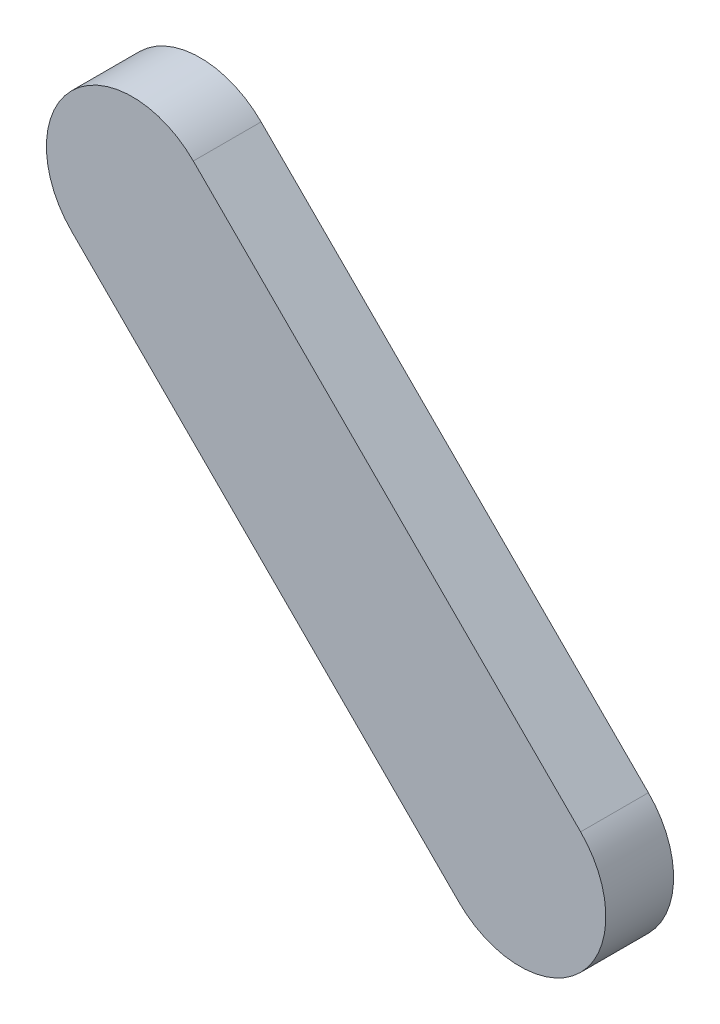
ISO-10303-21;
HEADER;
FILE_DESCRIPTION(('STEP AP214'),'2;1');
FILE_NAME('part.step','',(''),(''),'','','');
FILE_SCHEMA(('AUTOMOTIVE_DESIGN { 1 0 10303 214 1 1 1 1 }'));
ENDSEC;
DATA;
#1=APPLICATION_CONTEXT('core data for automotive mechanical design processes');
#2=APPLICATION_PROTOCOL_DEFINITION('international standard','automotive_design',2000,#1);
#3=PRODUCT_CONTEXT('',#1,'mechanical');
#4=PRODUCT('Part','Part','',(#3));
#5=PRODUCT_RELATED_PRODUCT_CATEGORY('part','',(#4));
#6=PRODUCT_DEFINITION_FORMATION('','',#4);
#7=PRODUCT_DEFINITION_CONTEXT('part definition',#1,'design');
#8=PRODUCT_DEFINITION('design','',#6,#7);
#9=PRODUCT_DEFINITION_SHAPE('','',#8);
#10=(LENGTH_UNIT() NAMED_UNIT(*) SI_UNIT(.MILLI.,.METRE.));
#11=(NAMED_UNIT(*) PLANE_ANGLE_UNIT() SI_UNIT($,.RADIAN.));
#12=(NAMED_UNIT(*) SI_UNIT($,.STERADIAN.) SOLID_ANGLE_UNIT());
#13=UNCERTAINTY_MEASURE_WITH_UNIT(LENGTH_MEASURE(1.E-05),#10,'distance_accuracy_value','');
#14=(GEOMETRIC_REPRESENTATION_CONTEXT(3) GLOBAL_UNCERTAINTY_ASSIGNED_CONTEXT((#13)) GLOBAL_UNIT_ASSIGNED_CONTEXT((#10,
#11,#12)) REPRESENTATION_CONTEXT('',''));
#15=CARTESIAN_POINT('',(0.,0.,0.));
#16=DIRECTION('',(0.,0.,1.));
#17=DIRECTION('',(1.,0.,0.));
#18=AXIS2_PLACEMENT_3D('',#15,#16,#17);
#19=CARTESIAN_POINT('',(130.37639406,107.36399406,0.));
#20=DIRECTION('',(0.707106781186548,0.707106781186548,0.));
#21=DIRECTION('',(0.707106781186548,-0.707106781186548,0.));
#22=AXIS2_PLACEMENT_3D('',#19,#20,#21);
#23=PLANE('',#22);
#24=DIRECTION('',(0.707106781186548,-0.707106781186548,0.));
#25=VECTOR('',#24,1.);
#26=CARTESIAN_POINT('',(130.37639406,107.36399406,0.1999996));
#27=LINE('',#26,#25);
#28=CARTESIAN_POINT('',(130.37639406,107.36399406,0.1999996));
#29=VERTEX_POINT('',#28);
#30=CARTESIAN_POINT('',(131.51939406,106.22099406,0.1999996));
#31=VERTEX_POINT('',#30);
#32=EDGE_CURVE('E11',#29,#31,#27,.T.);
#33=ORIENTED_EDGE('',*,*,#32,.F.);
#34=DIRECTION('',(0.,0.,1.));
#35=VECTOR('',#34,1.);
#36=CARTESIAN_POINT('',(130.37639406,107.36399406,0.));
#37=LINE('',#36,#35);
#38=CARTESIAN_POINT('',(130.37639406,107.36399406,0.));
#39=VERTEX_POINT('',#38);
#40=EDGE_CURVE('E24',#39,#29,#37,.T.);
#41=ORIENTED_EDGE('',*,*,#40,.F.);
#42=DIRECTION('',(0.707106781186548,-0.707106781186548,0.));
#43=VECTOR('',#42,1.);
#44=CARTESIAN_POINT('',(130.37639406,107.36399406,0.));
#45=LINE('',#44,#43);
#46=CARTESIAN_POINT('',(131.51939406,106.22099406,0.));
#47=VERTEX_POINT('',#46);
#48=EDGE_CURVE('E75',#39,#47,#45,.T.);
#49=ORIENTED_EDGE('',*,*,#48,.T.);
#50=DIRECTION('',(0.,0.,1.));
#51=VECTOR('',#50,1.);
#52=CARTESIAN_POINT('',(131.51939406,106.22099406,0.));
#53=LINE('',#52,#51);
#54=EDGE_CURVE('E37',#47,#31,#53,.T.);
#55=ORIENTED_EDGE('',*,*,#54,.T.);
#56=EDGE_LOOP('',(#33,#41,#49,#55));
#57=FACE_BOUND('',#56,.T.);
#58=ADVANCED_FACE('F17',(#57),#23,.F.);
#59=CARTESIAN_POINT('',(131.699,106.4006,0.));
#60=DIRECTION('',(0.,0.,-1.));
#61=DIRECTION('',(-0.707106781186576,-0.70710678118652,0.));
#62=AXIS2_PLACEMENT_3D('',#59,#60,#61);
#63=CYLINDRICAL_SURFACE('',#62,0.254001156230768);
#64=CARTESIAN_POINT('',(131.699,106.4006,0.1999996));
#65=DIRECTION('',(0.,0.,1.));
#66=DIRECTION('',(-0.707106781186576,-0.70710678118652,0.));
#67=AXIS2_PLACEMENT_3D('',#64,#65,#66);
#68=CIRCLE('',#67,0.254001156230768);
#69=CARTESIAN_POINT('',(131.87860594,106.58020594,0.1999996));
#70=VERTEX_POINT('',#69);
#71=EDGE_CURVE('E83',#31,#70,#68,.T.);
#72=ORIENTED_EDGE('',*,*,#71,.F.);
#73=ORIENTED_EDGE('',*,*,#54,.F.);
#74=CARTESIAN_POINT('',(131.699,106.4006,0.));
#75=DIRECTION('',(0.,0.,1.));
#76=DIRECTION('',(-0.707106781186576,-0.70710678118652,0.));
#77=AXIS2_PLACEMENT_3D('',#74,#75,#76);
#78=CIRCLE('',#77,0.254001156230768);
#79=CARTESIAN_POINT('',(131.87860594,106.58020594,0.));
#80=VERTEX_POINT('',#79);
#81=EDGE_CURVE('E81',#47,#80,#78,.T.);
#82=ORIENTED_EDGE('',*,*,#81,.T.);
#83=DIRECTION('',(0.,0.,1.));
#84=VECTOR('',#83,1.);
#85=CARTESIAN_POINT('',(131.87860594,106.58020594,0.));
#86=LINE('',#85,#84);
#87=EDGE_CURVE('E67',#80,#70,#86,.T.);
#88=ORIENTED_EDGE('',*,*,#87,.T.);
#89=EDGE_LOOP('',(#72,#73,#82,#88));
#90=FACE_BOUND('',#89,.T.);
#91=ADVANCED_FACE('F89',(#90),#63,.T.);
#92=CARTESIAN_POINT('',(131.87860594,106.58020594,0.));
#93=DIRECTION('',(-0.707106781186548,-0.707106781186548,0.));
#94=DIRECTION('',(-0.707106781186548,0.707106781186548,0.));
#95=AXIS2_PLACEMENT_3D('',#92,#93,#94);
#96=PLANE('',#95);
#97=DIRECTION('',(-0.707106781186548,0.707106781186548,0.));
#98=VECTOR('',#97,1.);
#99=CARTESIAN_POINT('',(131.87860594,106.58020594,0.1999996));
#100=LINE('',#99,#98);
#101=CARTESIAN_POINT('',(130.73560594,107.72320594,0.1999996));
#102=VERTEX_POINT('',#101);
#103=EDGE_CURVE('E71',#70,#102,#100,.T.);
#104=ORIENTED_EDGE('',*,*,#103,.F.);
#105=ORIENTED_EDGE('',*,*,#87,.F.);
#106=DIRECTION('',(-0.707106781186548,0.707106781186548,0.));
#107=VECTOR('',#106,1.);
#108=CARTESIAN_POINT('',(131.87860594,106.58020594,0.));
#109=LINE('',#108,#107);
#110=CARTESIAN_POINT('',(130.73560594,107.72320594,0.));
#111=VERTEX_POINT('',#110);
#112=EDGE_CURVE('E63',#80,#111,#109,.T.);
#113=ORIENTED_EDGE('',*,*,#112,.T.);
#114=DIRECTION('',(0.,0.,1.));
#115=VECTOR('',#114,1.);
#116=CARTESIAN_POINT('',(130.73560594,107.72320594,0.));
#117=LINE('',#116,#115);
#118=EDGE_CURVE('E53',#111,#102,#117,.T.);
#119=ORIENTED_EDGE('',*,*,#118,.T.);
#120=EDGE_LOOP('',(#104,#105,#113,#119));
#121=FACE_BOUND('',#120,.T.);
#122=ADVANCED_FACE('F66',(#121),#96,.F.);
#123=CARTESIAN_POINT('',(130.556,107.5436,0.));
#124=DIRECTION('',(0.,0.,-1.));
#125=DIRECTION('',(0.707106781186576,0.70710678118652,0.));
#126=AXIS2_PLACEMENT_3D('',#123,#124,#125);
#127=CYLINDRICAL_SURFACE('',#126,0.254001156230768);
#128=CARTESIAN_POINT('',(130.556,107.5436,0.1999996));
#129=DIRECTION('',(0.,0.,1.));
#130=DIRECTION('',(0.707106781186576,0.70710678118652,0.));
#131=AXIS2_PLACEMENT_3D('',#128,#129,#130);
#132=CIRCLE('',#131,0.254001156230768);
#133=EDGE_CURVE('E59',#102,#29,#132,.T.);
#134=ORIENTED_EDGE('',*,*,#133,.F.);
#135=ORIENTED_EDGE('',*,*,#118,.F.);
#136=CARTESIAN_POINT('',(130.556,107.5436,0.));
#137=DIRECTION('',(0.,0.,1.));
#138=DIRECTION('',(0.707106781186576,0.70710678118652,0.));
#139=AXIS2_PLACEMENT_3D('',#136,#137,#138);
#140=CIRCLE('',#139,0.254001156230768);
#141=EDGE_CURVE('E57',#111,#39,#140,.T.);
#142=ORIENTED_EDGE('',*,*,#141,.T.);
#143=ORIENTED_EDGE('',*,*,#40,.T.);
#144=EDGE_LOOP('',(#134,#135,#142,#143));
#145=FACE_BOUND('',#144,.T.);
#146=ADVANCED_FACE('F55',(#145),#127,.T.);
#147=CARTESIAN_POINT('',(130.37639406,107.36399406,0.));
#148=DIRECTION('',(0.,0.,-1.));
#149=DIRECTION('',(-1.,0.,0.));
#150=AXIS2_PLACEMENT_3D('',#147,#148,#149);
#151=PLANE('',#150);
#152=ORIENTED_EDGE('',*,*,#141,.F.);
#153=ORIENTED_EDGE('',*,*,#112,.F.);
#154=ORIENTED_EDGE('',*,*,#81,.F.);
#155=ORIENTED_EDGE('',*,*,#48,.F.);
#156=EDGE_LOOP('',(#152,#153,#154,#155));
#157=FACE_BOUND('',#156,.T.);
#158=ADVANCED_FACE('F74',(#157),#151,.T.);
#159=CARTESIAN_POINT('',(130.37639406,107.36399406,0.1999996));
#160=DIRECTION('',(0.,0.,-1.));
#161=DIRECTION('',(-1.,0.,0.));
#162=AXIS2_PLACEMENT_3D('',#159,#160,#161);
#163=PLANE('',#162);
#164=ORIENTED_EDGE('',*,*,#32,.T.);
#165=ORIENTED_EDGE('',*,*,#71,.T.);
#166=ORIENTED_EDGE('',*,*,#103,.T.);
#167=ORIENTED_EDGE('',*,*,#133,.T.);
#168=EDGE_LOOP('',(#164,#165,#166,#167));
#169=FACE_BOUND('',#168,.T.);
#170=ADVANCED_FACE('F91',(#169),#163,.F.);
#171=CLOSED_SHELL('',(#58,#91,#122,#146,#158,#170));
#172=MANIFOLD_SOLID_BREP('B1',#171);
#173=ADVANCED_BREP_SHAPE_REPRESENTATION('',(#18,#172),#14);
#174=SHAPE_DEFINITION_REPRESENTATION(#9,#173);
ENDSEC;
END-ISO-10303-21;
